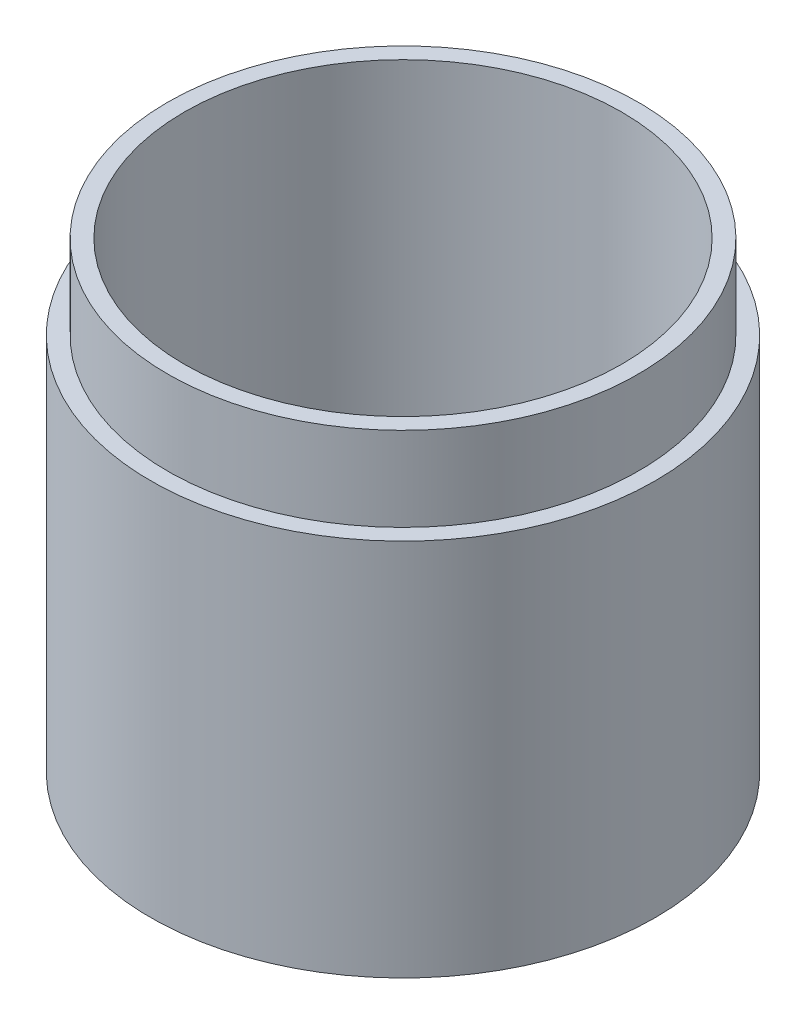
ISO-10303-21;
HEADER;
FILE_DESCRIPTION(('STEP AP214'),'2;1');
FILE_NAME('part.step','',(''),(''),'','','');
FILE_SCHEMA(('AUTOMOTIVE_DESIGN { 1 0 10303 214 1 1 1 1 }'));
ENDSEC;
DATA;
#1=APPLICATION_CONTEXT('core data for automotive mechanical design processes');
#2=APPLICATION_PROTOCOL_DEFINITION('international standard','automotive_design',2000,#1);
#3=PRODUCT_CONTEXT('',#1,'mechanical');
#4=PRODUCT('Part','Part','',(#3));
#5=PRODUCT_RELATED_PRODUCT_CATEGORY('part','',(#4));
#6=PRODUCT_DEFINITION_FORMATION('','',#4);
#7=PRODUCT_DEFINITION_CONTEXT('part definition',#1,'design');
#8=PRODUCT_DEFINITION('design','',#6,#7);
#9=PRODUCT_DEFINITION_SHAPE('','',#8);
#10=(LENGTH_UNIT() NAMED_UNIT(*) SI_UNIT(.MILLI.,.METRE.));
#11=(NAMED_UNIT(*) PLANE_ANGLE_UNIT() SI_UNIT($,.RADIAN.));
#12=(NAMED_UNIT(*) SI_UNIT($,.STERADIAN.) SOLID_ANGLE_UNIT());
#13=UNCERTAINTY_MEASURE_WITH_UNIT(LENGTH_MEASURE(1.E-05),#10,'distance_accuracy_value','');
#14=(GEOMETRIC_REPRESENTATION_CONTEXT(3) GLOBAL_UNCERTAINTY_ASSIGNED_CONTEXT((#13)) GLOBAL_UNIT_ASSIGNED_CONTEXT((#10,
#11,#12)) REPRESENTATION_CONTEXT('',''));
#15=CARTESIAN_POINT('',(0.,0.,0.));
#16=DIRECTION('',(0.,0.,1.));
#17=DIRECTION('',(1.,0.,0.));
#18=AXIS2_PLACEMENT_3D('',#15,#16,#17);
#19=CARTESIAN_POINT('',(0.,0.,0.));
#20=DIRECTION('',(0.,1.,0.));
#21=DIRECTION('',(-1.,0.,0.));
#22=AXIS2_PLACEMENT_3D('',#19,#20,#21);
#23=PLANE('',#22);
#24=CARTESIAN_POINT('',(0.,0.,0.));
#25=DIRECTION('',(0.,1.,0.));
#26=DIRECTION('',(-1.,0.,0.));
#27=AXIS2_PLACEMENT_3D('',#24,#25,#26);
#28=CIRCLE('',#27,38.1);
#29=CARTESIAN_POINT('',(-38.1,0.,0.));
#30=VERTEX_POINT('',#29);
#31=EDGE_CURVE('E10',#30,#30,#28,.T.);
#32=ORIENTED_EDGE('',*,*,#31,.F.);
#33=EDGE_LOOP('',(#32));
#34=FACE_BOUND('',#33,.T.);
#35=ADVANCED_FACE('F32',(#34),#23,.F.);
#36=CARTESIAN_POINT('',(0.,5.08,0.));
#37=DIRECTION('',(0.,1.,0.));
#38=DIRECTION('',(-1.,0.,0.));
#39=AXIS2_PLACEMENT_3D('',#36,#37,#38);
#40=CYLINDRICAL_SURFACE('',#39,38.1);
#41=CARTESIAN_POINT('',(0.,57.15,0.));
#42=DIRECTION('',(0.,1.,0.));
#43=DIRECTION('',(-1.,0.,0.));
#44=AXIS2_PLACEMENT_3D('',#41,#42,#43);
#45=CIRCLE('',#44,38.1);
#46=CARTESIAN_POINT('',(-38.1,57.15,0.));
#47=VERTEX_POINT('',#46);
#48=EDGE_CURVE('E38',#47,#47,#45,.T.);
#49=ORIENTED_EDGE('',*,*,#48,.F.);
#50=EDGE_LOOP('',(#49));
#51=FACE_BOUND('',#50,.T.);
#52=ORIENTED_EDGE('',*,*,#31,.T.);
#53=EDGE_LOOP('',(#52));
#54=FACE_BOUND('',#53,.T.);
#55=ADVANCED_FACE('F80',(#51,#54),#40,.T.);
#56=CARTESIAN_POINT('',(38.1,57.15,0.));
#57=DIRECTION('',(0.,-1.,0.));
#58=DIRECTION('',(1.,0.,0.));
#59=AXIS2_PLACEMENT_3D('',#56,#57,#58);
#60=PLANE('',#59);
#61=CARTESIAN_POINT('',(0.,57.15,0.));
#62=DIRECTION('',(0.,1.,0.));
#63=DIRECTION('',(-1.,0.,0.));
#64=AXIS2_PLACEMENT_3D('',#61,#62,#63);
#65=CIRCLE('',#64,35.56);
#66=CARTESIAN_POINT('',(-35.56,57.15,0.));
#67=VERTEX_POINT('',#66);
#68=EDGE_CURVE('E42',#67,#67,#65,.T.);
#69=ORIENTED_EDGE('',*,*,#68,.F.);
#70=EDGE_LOOP('',(#69));
#71=FACE_BOUND('',#70,.T.);
#72=ORIENTED_EDGE('',*,*,#48,.T.);
#73=EDGE_LOOP('',(#72));
#74=FACE_BOUND('',#73,.T.);
#75=ADVANCED_FACE('F75',(#71,#74),#60,.F.);
#76=CARTESIAN_POINT('',(0.,5.08,0.));
#77=DIRECTION('',(0.,1.,0.));
#78=DIRECTION('',(-1.,0.,0.));
#79=AXIS2_PLACEMENT_3D('',#76,#77,#78);
#80=CYLINDRICAL_SURFACE('',#79,35.56);
#81=CARTESIAN_POINT('',(0.,69.85,0.));
#82=DIRECTION('',(0.,1.,0.));
#83=DIRECTION('',(-1.,0.,0.));
#84=AXIS2_PLACEMENT_3D('',#81,#82,#83);
#85=CIRCLE('',#84,35.56);
#86=CARTESIAN_POINT('',(-35.56,69.85,0.));
#87=VERTEX_POINT('',#86);
#88=EDGE_CURVE('E46',#87,#87,#85,.T.);
#89=ORIENTED_EDGE('',*,*,#88,.F.);
#90=EDGE_LOOP('',(#89));
#91=FACE_BOUND('',#90,.T.);
#92=ORIENTED_EDGE('',*,*,#68,.T.);
#93=EDGE_LOOP('',(#92));
#94=FACE_BOUND('',#93,.T.);
#95=ADVANCED_FACE('F69',(#91,#94),#80,.T.);
#96=CARTESIAN_POINT('',(35.56,69.85,0.));
#97=DIRECTION('',(0.,-1.,0.));
#98=DIRECTION('',(1.,0.,0.));
#99=AXIS2_PLACEMENT_3D('',#96,#97,#98);
#100=PLANE('',#99);
#101=CARTESIAN_POINT('',(0.,69.85,0.));
#102=DIRECTION('',(0.,1.,0.));
#103=DIRECTION('',(-1.,0.,0.));
#104=AXIS2_PLACEMENT_3D('',#101,#102,#103);
#105=CIRCLE('',#104,33.02);
#106=CARTESIAN_POINT('',(-33.02,69.85,0.));
#107=VERTEX_POINT('',#106);
#108=EDGE_CURVE('E51',#107,#107,#105,.T.);
#109=ORIENTED_EDGE('',*,*,#108,.F.);
#110=EDGE_LOOP('',(#109));
#111=FACE_BOUND('',#110,.T.);
#112=ORIENTED_EDGE('',*,*,#88,.T.);
#113=EDGE_LOOP('',(#112));
#114=FACE_BOUND('',#113,.T.);
#115=ADVANCED_FACE('F63',(#111,#114),#100,.F.);
#116=CARTESIAN_POINT('',(0.,5.08,0.));
#117=DIRECTION('',(0.,1.,0.));
#118=DIRECTION('',(-1.,0.,0.));
#119=AXIS2_PLACEMENT_3D('',#116,#117,#118);
#120=CYLINDRICAL_SURFACE('',#119,33.02);
#121=CARTESIAN_POINT('',(0.,5.08,0.));
#122=DIRECTION('',(0.,1.,0.));
#123=DIRECTION('',(-1.,0.,0.));
#124=AXIS2_PLACEMENT_3D('',#121,#122,#123);
#125=CIRCLE('',#124,33.02);
#126=CARTESIAN_POINT('',(-33.02,5.08000000000001,0.));
#127=VERTEX_POINT('',#126);
#128=EDGE_CURVE('E54',#127,#127,#125,.T.);
#129=ORIENTED_EDGE('',*,*,#128,.F.);
#130=EDGE_LOOP('',(#129));
#131=FACE_BOUND('',#130,.T.);
#132=ORIENTED_EDGE('',*,*,#108,.T.);
#133=EDGE_LOOP('',(#132));
#134=FACE_BOUND('',#133,.T.);
#135=ADVANCED_FACE('F60',(#131,#134),#120,.F.);
#136=CARTESIAN_POINT('',(33.02,5.08,0.));
#137=DIRECTION('',(0.,-1.,0.));
#138=DIRECTION('',(1.,0.,0.));
#139=AXIS2_PLACEMENT_3D('',#136,#137,#138);
#140=PLANE('',#139);
#141=ORIENTED_EDGE('',*,*,#128,.T.);
#142=EDGE_LOOP('',(#141));
#143=FACE_BOUND('',#142,.T.);
#144=ADVANCED_FACE('F58',(#143),#140,.F.);
#145=CLOSED_SHELL('',(#35,#55,#75,#95,#115,#135,#144));
#146=MANIFOLD_SOLID_BREP('B2',#145);
#147=ADVANCED_BREP_SHAPE_REPRESENTATION('',(#18,#146),#14);
#148=SHAPE_DEFINITION_REPRESENTATION(#9,#147);
ENDSEC;
END-ISO-10303-21;
